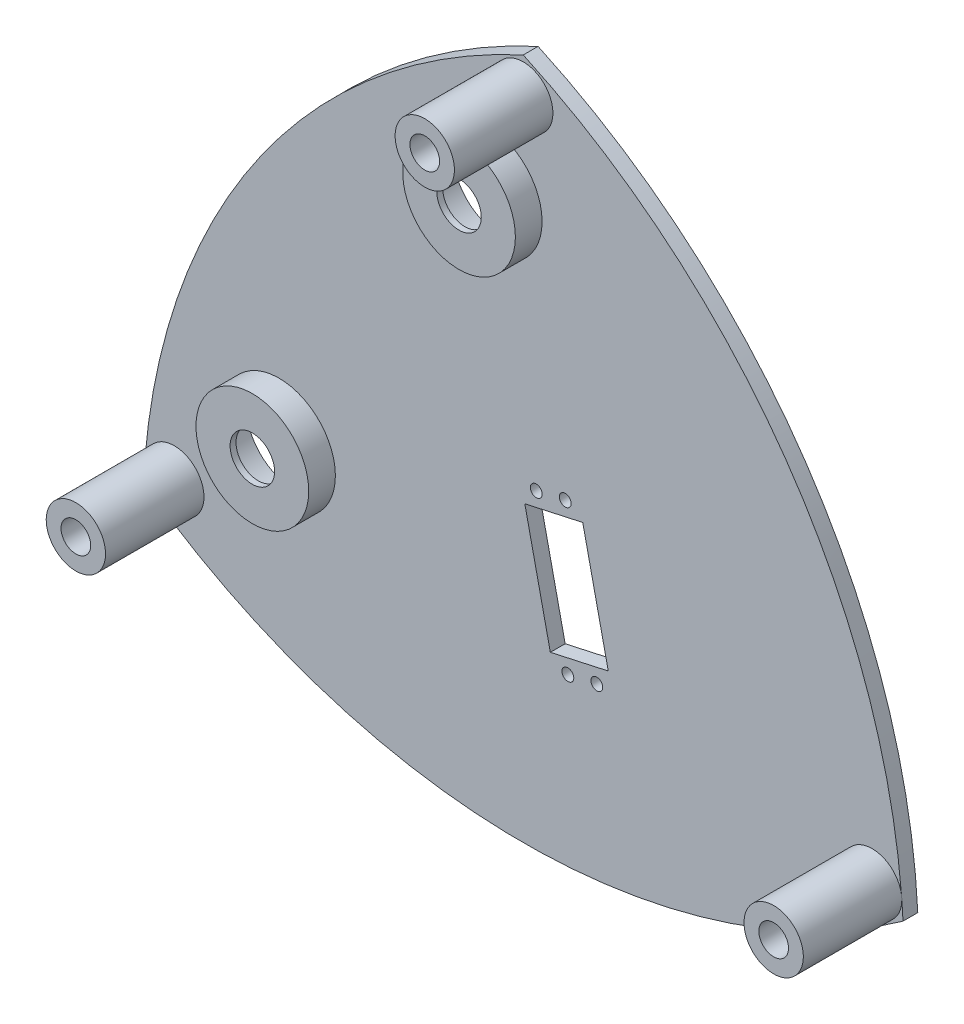
ISO-10303-21;
HEADER;
FILE_DESCRIPTION(('STEP AP214'),'2;1');
FILE_NAME('part.step','',(''),(''),'','','');
FILE_SCHEMA(('AUTOMOTIVE_DESIGN { 1 0 10303 214 1 1 1 1 }'));
ENDSEC;
DATA;
#1=APPLICATION_CONTEXT('core data for automotive mechanical design processes');
#2=APPLICATION_PROTOCOL_DEFINITION('international standard','automotive_design',2000,#1);
#3=PRODUCT_CONTEXT('',#1,'mechanical');
#4=PRODUCT('Part','Part','',(#3));
#5=PRODUCT_RELATED_PRODUCT_CATEGORY('part','',(#4));
#6=PRODUCT_DEFINITION_FORMATION('','',#4);
#7=PRODUCT_DEFINITION_CONTEXT('part definition',#1,'design');
#8=PRODUCT_DEFINITION('design','',#6,#7);
#9=PRODUCT_DEFINITION_SHAPE('','',#8);
#10=(LENGTH_UNIT() NAMED_UNIT(*) SI_UNIT(.MILLI.,.METRE.));
#11=(NAMED_UNIT(*) PLANE_ANGLE_UNIT() SI_UNIT($,.RADIAN.));
#12=(NAMED_UNIT(*) SI_UNIT($,.STERADIAN.) SOLID_ANGLE_UNIT());
#13=UNCERTAINTY_MEASURE_WITH_UNIT(LENGTH_MEASURE(1.E-05),#10,'distance_accuracy_value','');
#14=(GEOMETRIC_REPRESENTATION_CONTEXT(3) GLOBAL_UNCERTAINTY_ASSIGNED_CONTEXT((#13)) GLOBAL_UNIT_ASSIGNED_CONTEXT((#10,
#11,#12)) REPRESENTATION_CONTEXT('',''));
#15=CARTESIAN_POINT('',(0.,0.,0.));
#16=DIRECTION('',(0.,0.,1.));
#17=DIRECTION('',(1.,0.,0.));
#18=AXIS2_PLACEMENT_3D('',#15,#16,#17);
#19=CARTESIAN_POINT('',(-12.6509950664098,69.5155367413891,15.));
#20=DIRECTION('',(0.,0.,-1.));
#21=DIRECTION('',(-1.,0.,0.));
#22=AXIS2_PLACEMENT_3D('',#19,#20,#21);
#23=CYLINDRICAL_SURFACE('',#22,16.);
#24=CARTESIAN_POINT('',(-12.6509950664098,69.5155367413891,0.));
#25=DIRECTION('',(0.,0.,-1.));
#26=DIRECTION('',(-1.,0.,0.));
#27=AXIS2_PLACEMENT_3D('',#24,#25,#26);
#28=CIRCLE('',#27,16.);
#29=CARTESIAN_POINT('',(-28.6509950664098,69.5155367413891,0.));
#30=VERTEX_POINT('',#29);
#31=EDGE_CURVE('E168',#30,#30,#28,.T.);
#32=ORIENTED_EDGE('',*,*,#31,.T.);
#33=EDGE_LOOP('',(#32));
#34=FACE_BOUND('',#33,.T.);
#35=CARTESIAN_POINT('',(-12.6509950664098,69.5155367413891,12.));
#36=DIRECTION('',(0.,0.,1.));
#37=DIRECTION('',(1.,0.,0.));
#38=AXIS2_PLACEMENT_3D('',#35,#36,#37);
#39=CIRCLE('',#38,16.);
#40=CARTESIAN_POINT('',(3.34900493359024,69.5155367413891,12.));
#41=VERTEX_POINT('',#40);
#42=EDGE_CURVE('E11',#41,#41,#39,.F.);
#43=ORIENTED_EDGE('',*,*,#42,.F.);
#44=EDGE_LOOP('',(#43));
#45=FACE_BOUND('',#44,.T.);
#46=ADVANCED_FACE('F35',(#34,#45),#23,.F.);
#47=CARTESIAN_POINT('',(-82.3341256154467,-39.5307187827285,15.));
#48=DIRECTION('',(0.,0.,-1.));
#49=DIRECTION('',(-1.,0.,0.));
#50=AXIS2_PLACEMENT_3D('',#47,#48,#49);
#51=CYLINDRICAL_SURFACE('',#50,16.);
#52=CARTESIAN_POINT('',(-82.3341256154467,-39.5307187827285,0.));
#53=DIRECTION('',(0.,0.,-1.));
#54=DIRECTION('',(-1.,0.,0.));
#55=AXIS2_PLACEMENT_3D('',#52,#53,#54);
#56=CIRCLE('',#55,16.);
#57=CARTESIAN_POINT('',(-98.3341256154467,-39.5307187827285,0.));
#58=VERTEX_POINT('',#57);
#59=EDGE_CURVE('E171',#58,#58,#56,.T.);
#60=ORIENTED_EDGE('',*,*,#59,.T.);
#61=EDGE_LOOP('',(#60));
#62=FACE_BOUND('',#61,.T.);
#63=CARTESIAN_POINT('',(-82.3341256154467,-39.5307187827285,12.));
#64=DIRECTION('',(0.,0.,1.));
#65=DIRECTION('',(1.,0.,0.));
#66=AXIS2_PLACEMENT_3D('',#63,#64,#65);
#67=CIRCLE('',#66,16.);
#68=CARTESIAN_POINT('',(-66.3341256154467,-39.5307187827285,12.));
#69=VERTEX_POINT('',#68);
#70=EDGE_CURVE('E44',#69,#69,#67,.F.);
#71=ORIENTED_EDGE('',*,*,#70,.F.);
#72=EDGE_LOOP('',(#71));
#73=FACE_BOUND('',#72,.T.);
#74=ADVANCED_FACE('F278',(#62,#73),#51,.F.);
#75=CARTESIAN_POINT('',(-45.8494592180799,10.0108651432086,5.));
#76=DIRECTION('',(0.,0.,1.));
#77=DIRECTION('',(1.,0.,0.));
#78=AXIS2_PLACEMENT_3D('',#75,#76,#77);
#79=PLANE('',#78);
#80=CARTESIAN_POINT('',(24.8075352335168,-56.2577365393745,5.));
#81=DIRECTION('',(0.,0.,1.));
#82=DIRECTION('',(1.,0.,0.));
#83=AXIS2_PLACEMENT_3D('',#80,#81,#82);
#84=CIRCLE('',#83,2.);
#85=CARTESIAN_POINT('',(26.8075352335168,-56.2577365393745,5.));
#86=VERTEX_POINT('',#85);
#87=EDGE_CURVE('E262',#86,#86,#84,.T.);
#88=ORIENTED_EDGE('',*,*,#87,.F.);
#89=EDGE_LOOP('',(#88));
#90=FACE_BOUND('',#89,.T.);
#91=CARTESIAN_POINT('',(4.39491628208414,-10.067099094719,5.));
#92=DIRECTION('',(0.,0.,1.));
#93=DIRECTION('',(1.,0.,0.));
#94=AXIS2_PLACEMENT_3D('',#91,#92,#93);
#95=CIRCLE('',#94,2.);
#96=CARTESIAN_POINT('',(6.39491628208414,-10.067099094719,5.));
#97=VERTEX_POINT('',#96);
#98=EDGE_CURVE('E263',#97,#97,#95,.T.);
#99=ORIENTED_EDGE('',*,*,#98,.F.);
#100=EDGE_LOOP('',(#99));
#101=FACE_BOUND('',#100,.T.);
#102=CARTESIAN_POINT('',(14.1608715532331,-7.91625794718695,5.));
#103=DIRECTION('',(0.,0.,1.));
#104=DIRECTION('',(1.,0.,0.));
#105=AXIS2_PLACEMENT_3D('',#102,#103,#104);
#106=CIRCLE('',#105,2.);
#107=CARTESIAN_POINT('',(16.1608715532331,-7.91625794718695,5.));
#108=VERTEX_POINT('',#107);
#109=EDGE_CURVE('E266',#108,#108,#106,.T.);
#110=ORIENTED_EDGE('',*,*,#109,.F.);
#111=EDGE_LOOP('',(#110));
#112=FACE_BOUND('',#111,.T.);
#113=CARTESIAN_POINT('',(15.0415799623678,-58.4085776869066,5.));
#114=DIRECTION('',(0.,0.,1.));
#115=DIRECTION('',(1.,0.,0.));
#116=AXIS2_PLACEMENT_3D('',#113,#114,#115);
#117=CIRCLE('',#116,2.00000000000001);
#118=CARTESIAN_POINT('',(17.0415799623678,-58.4085776869066,5.));
#119=VERTEX_POINT('',#118);
#120=EDGE_CURVE('E250',#119,#119,#117,.T.);
#121=ORIENTED_EDGE('',*,*,#120,.F.);
#122=EDGE_LOOP('',(#121));
#123=FACE_BOUND('',#122,.T.);
#124=DIRECTION('',(0.215084114753205,-0.976595527114901,0.));
#125=VECTOR('',#124,1.);
#126=CARTESIAN_POINT('',(-7.02980536355838,18.5604546636439,5.));
#127=LINE('',#126,#125);
#128=CARTESIAN_POINT('',(0.53358819158736,-15.7813484222808,5.));
#129=VERTEX_POINT('',#128);
#130=CARTESIAN_POINT('',(9.13695278171554,-54.8451695068768,5.));
#131=VERTEX_POINT('',#130);
#132=EDGE_CURVE('E141',#129,#131,#127,.T.);
#133=ORIENTED_EDGE('',*,*,#132,.F.);
#134=DIRECTION('',(-0.976595527114901,-0.215084114753205,0.));
#135=VECTOR('',#134,1.);
#136=CARTESIAN_POINT('',(-38.2860656629342,-24.3309379427162,5.));
#137=LINE('',#136,#135);
#138=CARTESIAN_POINT('',(20.0654987338854,-11.4796661272167,5.));
#139=VERTEX_POINT('',#138);
#140=EDGE_CURVE('E134',#139,#129,#137,.T.);
#141=ORIENTED_EDGE('',*,*,#140,.F.);
#142=DIRECTION('',(-0.215084114753205,0.976595527114901,0.));
#143=VECTOR('',#142,1.);
#144=CARTESIAN_POINT('',(12.5021051787396,22.862136958708,5.));
#145=LINE('',#144,#143);
#146=CARTESIAN_POINT('',(28.6688633240136,-50.5434872118127,5.));
#147=VERTEX_POINT('',#146);
#148=EDGE_CURVE('E114',#147,#139,#145,.T.);
#149=ORIENTED_EDGE('',*,*,#148,.F.);
#150=DIRECTION('',(0.976595527114901,0.215084114753205,0.));
#151=VECTOR('',#150,1.);
#152=CARTESIAN_POINT('',(-29.682701072806,-63.3947590273122,5.));
#153=LINE('',#152,#151);
#154=EDGE_CURVE('E139',#131,#147,#153,.T.);
#155=ORIENTED_EDGE('',*,*,#154,.F.);
#156=EDGE_LOOP('',(#133,#141,#149,#155));
#157=FACE_BOUND('',#156,.T.);
#158=CARTESIAN_POINT('',(-82.3341256154467,-39.5307187827285,5.));
#159=DIRECTION('',(0.,0.,1.));
#160=DIRECTION('',(1.,0.,0.));
#161=AXIS2_PLACEMENT_3D('',#158,#159,#160);
#162=CIRCLE('',#161,19.);
#163=CARTESIAN_POINT('',(-63.3341256154467,-39.5307187827285,5.));
#164=VERTEX_POINT('',#163);
#165=EDGE_CURVE('E162',#164,#164,#162,.T.);
#166=ORIENTED_EDGE('',*,*,#165,.F.);
#167=EDGE_LOOP('',(#166));
#168=FACE_BOUND('',#167,.T.);
#169=CARTESIAN_POINT('',(0.,103.,5.));
#170=DIRECTION('',(0.,0.,1.));
#171=DIRECTION('',(1.,0.,0.));
#172=AXIS2_PLACEMENT_3D('',#169,#170,#171);
#173=CIRCLE('',#172,10.);
#174=CARTESIAN_POINT('',(-10.,103.,5.));
#175=VERTEX_POINT('',#174);
#176=EDGE_CURVE('E205',#175,#175,#173,.T.);
#177=ORIENTED_EDGE('',*,*,#176,.F.);
#178=EDGE_LOOP('',(#177));
#179=FACE_BOUND('',#178,.T.);
#180=CARTESIAN_POINT('',(-91.6989184361599,-84.9782697135829,5.));
#181=DIRECTION('',(0.,0.,1.));
#182=DIRECTION('',(1.,0.,0.));
#183=AXIS2_PLACEMENT_3D('',#180,#181,#182);
#184=CIRCLE('',#183,220.);
#185=CARTESIAN_POINT('',(128.022678921713,-73.9139281378286,5.));
#186=VERTEX_POINT('',#185);
#187=CARTESIAN_POINT('',(127.62978060665,-67.804983010433,5.));
#188=VERTEX_POINT('',#187);
#189=EDGE_CURVE('E226',#186,#188,#184,.T.);
#190=ORIENTED_EDGE('',*,*,#189,.T.);
#191=CARTESIAN_POINT('',(117.630374076299,-67.9139281378286,5.));
#192=DIRECTION('',(0.,0.,1.));
#193=DIRECTION('',(1.,0.,0.));
#194=AXIS2_PLACEMENT_3D('',#191,#192,#193);
#195=CIRCLE('',#194,9.99999999999999);
#196=CARTESIAN_POINT('',(127.515403429057,-66.4019113736612,5.));
#197=VERTEX_POINT('',#196);
#198=EDGE_CURVE('E179',#197,#188,#195,.T.);
#199=ORIENTED_EDGE('',*,*,#198,.F.);
#200=CARTESIAN_POINT('',(0.,115.,5.));
#201=VERTEX_POINT('',#200);
#202=EDGE_CURVE('E224',#197,#201,#184,.T.);
#203=ORIENTED_EDGE('',*,*,#202,.T.);
#204=CARTESIAN_POINT('',(91.6989184361599,-84.9782697135829,5.));
#205=DIRECTION('',(0.,0.,1.));
#206=DIRECTION('',(-1.,0.,0.));
#207=AXIS2_PLACEMENT_3D('',#204,#205,#206);
#208=CIRCLE('',#207,220.);
#209=CARTESIAN_POINT('',(-127.515403429057,-66.4019113736612,5.));
#210=VERTEX_POINT('',#209);
#211=EDGE_CURVE('E230',#201,#210,#208,.T.);
#212=ORIENTED_EDGE('',*,*,#211,.T.);
#213=CARTESIAN_POINT('',(-117.630374076299,-67.9139281378286,5.));
#214=DIRECTION('',(0.,0.,1.));
#215=DIRECTION('',(1.,0.,0.));
#216=AXIS2_PLACEMENT_3D('',#213,#214,#215);
#217=CIRCLE('',#216,9.99999999999999);
#218=CARTESIAN_POINT('',(-127.62978060665,-67.804983010433,5.));
#219=VERTEX_POINT('',#218);
#220=EDGE_CURVE('E192',#219,#210,#217,.T.);
#221=ORIENTED_EDGE('',*,*,#220,.F.);
#222=CARTESIAN_POINT('',(-128.022678921713,-73.9139281378286,5.));
#223=VERTEX_POINT('',#222);
#224=EDGE_CURVE('E229',#219,#223,#208,.T.);
#225=ORIENTED_EDGE('',*,*,#224,.T.);
#226=CARTESIAN_POINT('',(0.,105.,5.));
#227=DIRECTION('',(0.,0.,1.));
#228=DIRECTION('',(1.,0.,0.));
#229=AXIS2_PLACEMENT_3D('',#226,#227,#228);
#230=CIRCLE('',#229,220.);
#231=EDGE_CURVE('E221',#223,#186,#230,.T.);
#232=ORIENTED_EDGE('',*,*,#231,.T.);
#233=EDGE_LOOP('',(#190,#199,#203,#212,#221,#225,#232));
#234=FACE_BOUND('',#233,.T.);
#235=CARTESIAN_POINT('',(-12.6509950664098,69.5155367413891,5.));
#236=DIRECTION('',(0.,0.,1.));
#237=DIRECTION('',(1.,0.,0.));
#238=AXIS2_PLACEMENT_3D('',#235,#236,#237);
#239=CIRCLE('',#238,19.);
#240=CARTESIAN_POINT('',(6.34900493359023,69.5155367413891,5.));
#241=VERTEX_POINT('',#240);
#242=EDGE_CURVE('E153',#241,#241,#239,.T.);
#243=ORIENTED_EDGE('',*,*,#242,.F.);
#244=EDGE_LOOP('',(#243));
#245=FACE_BOUND('',#244,.T.);
#246=ADVANCED_FACE('F275',(#90,#101,#112,#123,#157,#168,#179,#234,#245),#79,.T.);
#247=CARTESIAN_POINT('',(-45.8494592180799,10.0108651432086,0.));
#248=DIRECTION('',(0.,0.,1.));
#249=DIRECTION('',(1.,0.,0.));
#250=AXIS2_PLACEMENT_3D('',#247,#248,#249);
#251=PLANE('',#250);
#252=CARTESIAN_POINT('',(24.8075352335168,-56.2577365393745,0.));
#253=DIRECTION('',(0.,0.,1.));
#254=DIRECTION('',(1.,0.,0.));
#255=AXIS2_PLACEMENT_3D('',#252,#253,#254);
#256=CIRCLE('',#255,2.);
#257=CARTESIAN_POINT('',(26.8075352335168,-56.2577365393745,0.));
#258=VERTEX_POINT('',#257);
#259=EDGE_CURVE('E39',#258,#258,#256,.T.);
#260=ORIENTED_EDGE('',*,*,#259,.T.);
#261=EDGE_LOOP('',(#260));
#262=FACE_BOUND('',#261,.T.);
#263=CARTESIAN_POINT('',(4.39491628208414,-10.067099094719,0.));
#264=DIRECTION('',(0.,0.,1.));
#265=DIRECTION('',(1.,0.,0.));
#266=AXIS2_PLACEMENT_3D('',#263,#264,#265);
#267=CIRCLE('',#266,2.);
#268=CARTESIAN_POINT('',(6.39491628208414,-10.067099094719,0.));
#269=VERTEX_POINT('',#268);
#270=EDGE_CURVE('E252',#269,#269,#267,.T.);
#271=ORIENTED_EDGE('',*,*,#270,.T.);
#272=EDGE_LOOP('',(#271));
#273=FACE_BOUND('',#272,.T.);
#274=CARTESIAN_POINT('',(14.1608715532331,-7.91625794718695,0.));
#275=DIRECTION('',(0.,0.,1.));
#276=DIRECTION('',(1.,0.,0.));
#277=AXIS2_PLACEMENT_3D('',#274,#275,#276);
#278=CIRCLE('',#277,2.);
#279=CARTESIAN_POINT('',(16.1608715532331,-7.91625794718695,0.));
#280=VERTEX_POINT('',#279);
#281=EDGE_CURVE('E249',#280,#280,#278,.T.);
#282=ORIENTED_EDGE('',*,*,#281,.T.);
#283=EDGE_LOOP('',(#282));
#284=FACE_BOUND('',#283,.T.);
#285=CARTESIAN_POINT('',(15.0415799623678,-58.4085776869066,0.));
#286=DIRECTION('',(0.,0.,1.));
#287=DIRECTION('',(1.,0.,0.));
#288=AXIS2_PLACEMENT_3D('',#285,#286,#287);
#289=CIRCLE('',#288,2.00000000000001);
#290=CARTESIAN_POINT('',(17.0415799623678,-58.4085776869066,0.));
#291=VERTEX_POINT('',#290);
#292=EDGE_CURVE('E246',#291,#291,#289,.T.);
#293=ORIENTED_EDGE('',*,*,#292,.T.);
#294=EDGE_LOOP('',(#293));
#295=FACE_BOUND('',#294,.T.);
#296=DIRECTION('',(0.976595527114901,0.215084114753205,0.));
#297=VECTOR('',#296,1.);
#298=CARTESIAN_POINT('',(20.0654987338854,-11.4796661272167,0.));
#299=LINE('',#298,#297);
#300=CARTESIAN_POINT('',(0.533588191587359,-15.7813484222808,0.));
#301=VERTEX_POINT('',#300);
#302=CARTESIAN_POINT('',(20.0654987338854,-11.4796661272167,0.));
#303=VERTEX_POINT('',#302);
#304=EDGE_CURVE('E120',#301,#303,#299,.T.);
#305=ORIENTED_EDGE('',*,*,#304,.F.);
#306=DIRECTION('',(-0.215084114753205,0.9765955271149,0.));
#307=VECTOR('',#306,1.);
#308=CARTESIAN_POINT('',(0.53358819158736,-15.7813484222808,0.));
#309=LINE('',#308,#307);
#310=CARTESIAN_POINT('',(9.13695278171554,-54.8451695068768,0.));
#311=VERTEX_POINT('',#310);
#312=EDGE_CURVE('E60',#311,#301,#309,.T.);
#313=ORIENTED_EDGE('',*,*,#312,.F.);
#314=DIRECTION('',(-0.976595527114901,-0.215084114753205,0.));
#315=VECTOR('',#314,1.);
#316=CARTESIAN_POINT('',(9.13695278171554,-54.8451695068768,0.));
#317=LINE('',#316,#315);
#318=CARTESIAN_POINT('',(28.6688633240136,-50.5434872118127,0.));
#319=VERTEX_POINT('',#318);
#320=EDGE_CURVE('E127',#319,#311,#317,.T.);
#321=ORIENTED_EDGE('',*,*,#320,.F.);
#322=DIRECTION('',(0.215084114753205,-0.9765955271149,0.));
#323=VECTOR('',#322,1.);
#324=CARTESIAN_POINT('',(28.6688633240136,-50.5434872118127,0.));
#325=LINE('',#324,#323);
#326=EDGE_CURVE('E111',#303,#319,#325,.T.);
#327=ORIENTED_EDGE('',*,*,#326,.F.);
#328=EDGE_LOOP('',(#305,#313,#321,#327));
#329=FACE_BOUND('',#328,.T.);
#330=ORIENTED_EDGE('',*,*,#59,.F.);
#331=EDGE_LOOP('',(#330));
#332=FACE_BOUND('',#331,.T.);
#333=ORIENTED_EDGE('',*,*,#31,.F.);
#334=EDGE_LOOP('',(#333));
#335=FACE_BOUND('',#334,.T.);
#336=CARTESIAN_POINT('',(0.,105.,0.));
#337=DIRECTION('',(0.,0.,1.));
#338=DIRECTION('',(1.,0.,0.));
#339=AXIS2_PLACEMENT_3D('',#336,#337,#338);
#340=CIRCLE('',#339,220.);
#341=CARTESIAN_POINT('',(-128.022678921713,-73.9139281378286,0.));
#342=VERTEX_POINT('',#341);
#343=CARTESIAN_POINT('',(128.022678921713,-73.9139281378286,0.));
#344=VERTEX_POINT('',#343);
#345=EDGE_CURVE('E220',#342,#344,#340,.T.);
#346=ORIENTED_EDGE('',*,*,#345,.F.);
#347=CARTESIAN_POINT('',(91.6989184361599,-84.9782697135829,0.));
#348=DIRECTION('',(0.,0.,1.));
#349=DIRECTION('',(-1.,0.,0.));
#350=AXIS2_PLACEMENT_3D('',#347,#348,#349);
#351=CIRCLE('',#350,220.);
#352=CARTESIAN_POINT('',(0.,115.,0.));
#353=VERTEX_POINT('',#352);
#354=EDGE_CURVE('E225',#353,#342,#351,.T.);
#355=ORIENTED_EDGE('',*,*,#354,.F.);
#356=CARTESIAN_POINT('',(-91.6989184361599,-84.9782697135829,0.));
#357=DIRECTION('',(0.,0.,1.));
#358=DIRECTION('',(1.,0.,0.));
#359=AXIS2_PLACEMENT_3D('',#356,#357,#358);
#360=CIRCLE('',#359,220.);
#361=EDGE_CURVE('E236',#344,#353,#360,.T.);
#362=ORIENTED_EDGE('',*,*,#361,.F.);
#363=EDGE_LOOP('',(#346,#355,#362));
#364=FACE_BOUND('',#363,.T.);
#365=CARTESIAN_POINT('',(-117.630374076299,-67.9139281378286,0.));
#366=DIRECTION('',(0.,0.,1.));
#367=DIRECTION('',(1.,0.,0.));
#368=AXIS2_PLACEMENT_3D('',#365,#366,#367);
#369=CIRCLE('',#368,5.00000000000001);
#370=CARTESIAN_POINT('',(-112.630374076299,-67.9139281378286,0.));
#371=VERTEX_POINT('',#370);
#372=EDGE_CURVE('E217',#371,#371,#369,.T.);
#373=ORIENTED_EDGE('',*,*,#372,.T.);
#374=EDGE_LOOP('',(#373));
#375=FACE_BOUND('',#374,.T.);
#376=CARTESIAN_POINT('',(117.630374076299,-67.9139281378286,0.));
#377=DIRECTION('',(0.,0.,1.));
#378=DIRECTION('',(1.,0.,0.));
#379=AXIS2_PLACEMENT_3D('',#376,#377,#378);
#380=CIRCLE('',#379,5.00000000000001);
#381=CARTESIAN_POINT('',(122.630374076299,-67.9139281378286,0.));
#382=VERTEX_POINT('',#381);
#383=EDGE_CURVE('E214',#382,#382,#380,.T.);
#384=ORIENTED_EDGE('',*,*,#383,.T.);
#385=EDGE_LOOP('',(#384));
#386=FACE_BOUND('',#385,.T.);
#387=CARTESIAN_POINT('',(0.,103.,0.));
#388=DIRECTION('',(0.,0.,1.));
#389=DIRECTION('',(1.,0.,0.));
#390=AXIS2_PLACEMENT_3D('',#387,#388,#389);
#391=CIRCLE('',#390,5.);
#392=CARTESIAN_POINT('',(5.,103.,0.));
#393=VERTEX_POINT('',#392);
#394=EDGE_CURVE('E209',#393,#393,#391,.T.);
#395=ORIENTED_EDGE('',*,*,#394,.T.);
#396=EDGE_LOOP('',(#395));
#397=FACE_BOUND('',#396,.T.);
#398=ADVANCED_FACE('F124',(#262,#273,#284,#295,#329,#332,#335,#364,#375,#386,#397),#251,.F.);
#399=CARTESIAN_POINT('',(0.,105.,5.));
#400=DIRECTION('',(0.,0.,-1.));
#401=DIRECTION('',(-1.,0.,0.));
#402=AXIS2_PLACEMENT_3D('',#399,#400,#401);
#403=CYLINDRICAL_SURFACE('',#402,220.);
#404=ORIENTED_EDGE('',*,*,#345,.T.);
#405=DIRECTION('',(0.,0.,-1.));
#406=VECTOR('',#405,1.);
#407=CARTESIAN_POINT('',(128.022678921713,-73.9139281378286,5.));
#408=LINE('',#407,#406);
#409=EDGE_CURVE('E158',#186,#344,#408,.T.);
#410=ORIENTED_EDGE('',*,*,#409,.F.);
#411=ORIENTED_EDGE('',*,*,#231,.F.);
#412=DIRECTION('',(0.,0.,-1.));
#413=VECTOR('',#412,1.);
#414=CARTESIAN_POINT('',(-128.022678921713,-73.9139281378286,5.));
#415=LINE('',#414,#413);
#416=EDGE_CURVE('E233',#223,#342,#415,.T.);
#417=ORIENTED_EDGE('',*,*,#416,.T.);
#418=EDGE_LOOP('',(#404,#410,#411,#417));
#419=FACE_BOUND('',#418,.T.);
#420=ADVANCED_FACE('F37',(#419),#403,.T.);
#421=CARTESIAN_POINT('',(-91.6989184361599,-84.9782697135829,5.));
#422=DIRECTION('',(0.,0.,-1.));
#423=DIRECTION('',(-1.,0.,0.));
#424=AXIS2_PLACEMENT_3D('',#421,#422,#423);
#425=CYLINDRICAL_SURFACE('',#424,220.);
#426=ORIENTED_EDGE('',*,*,#361,.T.);
#427=DIRECTION('',(0.,0.,-1.));
#428=VECTOR('',#427,1.);
#429=CARTESIAN_POINT('',(0.,115.,5.));
#430=LINE('',#429,#428);
#431=EDGE_CURVE('E241',#201,#353,#430,.T.);
#432=ORIENTED_EDGE('',*,*,#431,.F.);
#433=ORIENTED_EDGE('',*,*,#202,.F.);
#434=CARTESIAN_POINT('',(-91.6989184361599,-84.9782697135829,5.));
#435=DIRECTION('',(0.,0.,1.));
#436=DIRECTION('',(1.,0.,0.));
#437=AXIS2_PLACEMENT_3D('',#434,#435,#436);
#438=CIRCLE('',#437,220.);
#439=EDGE_CURVE('E183',#188,#197,#438,.T.);
#440=ORIENTED_EDGE('',*,*,#439,.F.);
#441=ORIENTED_EDGE('',*,*,#189,.F.);
#442=ORIENTED_EDGE('',*,*,#409,.T.);
#443=EDGE_LOOP('',(#426,#432,#433,#440,#441,#442));
#444=FACE_BOUND('',#443,.T.);
#445=ADVANCED_FACE('F373',(#444),#425,.T.);
#446=CARTESIAN_POINT('',(91.6989184361599,-84.9782697135829,5.));
#447=DIRECTION('',(0.,0.,-1.));
#448=DIRECTION('',(-1.,0.,0.));
#449=AXIS2_PLACEMENT_3D('',#446,#447,#448);
#450=CYLINDRICAL_SURFACE('',#449,220.);
#451=ORIENTED_EDGE('',*,*,#354,.T.);
#452=ORIENTED_EDGE('',*,*,#416,.F.);
#453=ORIENTED_EDGE('',*,*,#224,.F.);
#454=CARTESIAN_POINT('',(91.6989184361599,-84.9782697135829,5.));
#455=DIRECTION('',(0.,0.,1.));
#456=DIRECTION('',(1.,0.,0.));
#457=AXIS2_PLACEMENT_3D('',#454,#455,#456);
#458=CIRCLE('',#457,220.);
#459=EDGE_CURVE('E196',#210,#219,#458,.T.);
#460=ORIENTED_EDGE('',*,*,#459,.F.);
#461=ORIENTED_EDGE('',*,*,#211,.F.);
#462=ORIENTED_EDGE('',*,*,#431,.T.);
#463=EDGE_LOOP('',(#451,#452,#453,#460,#461,#462));
#464=FACE_BOUND('',#463,.T.);
#465=ADVANCED_FACE('F367',(#464),#450,.T.);
#466=CARTESIAN_POINT('',(-117.630374076299,-67.9139281378286,5.));
#467=DIRECTION('',(0.,0.,-1.));
#468=DIRECTION('',(-1.,0.,0.));
#469=AXIS2_PLACEMENT_3D('',#466,#467,#468);
#470=CYLINDRICAL_SURFACE('',#469,5.00000000000001);
#471=ORIENTED_EDGE('',*,*,#372,.F.);
#472=EDGE_LOOP('',(#471));
#473=FACE_BOUND('',#472,.T.);
#474=CARTESIAN_POINT('',(-117.630374076299,-67.9139281378286,38.2));
#475=DIRECTION('',(0.,0.,1.));
#476=DIRECTION('',(1.,0.,0.));
#477=AXIS2_PLACEMENT_3D('',#474,#475,#476);
#478=CIRCLE('',#477,5.00000000000001);
#479=CARTESIAN_POINT('',(-112.630374076299,-67.9139281378286,38.2));
#480=VERTEX_POINT('',#479);
#481=EDGE_CURVE('E189',#480,#480,#478,.T.);
#482=ORIENTED_EDGE('',*,*,#481,.T.);
#483=EDGE_LOOP('',(#482));
#484=FACE_BOUND('',#483,.T.);
#485=ADVANCED_FACE('F364',(#473,#484),#470,.F.);
#486=CARTESIAN_POINT('',(117.630374076299,-67.9139281378286,5.));
#487=DIRECTION('',(0.,0.,-1.));
#488=DIRECTION('',(-1.,0.,0.));
#489=AXIS2_PLACEMENT_3D('',#486,#487,#488);
#490=CYLINDRICAL_SURFACE('',#489,5.00000000000001);
#491=ORIENTED_EDGE('',*,*,#383,.F.);
#492=EDGE_LOOP('',(#491));
#493=FACE_BOUND('',#492,.T.);
#494=CARTESIAN_POINT('',(117.630374076299,-67.9139281378286,38.2));
#495=DIRECTION('',(0.,0.,1.));
#496=DIRECTION('',(1.,0.,0.));
#497=AXIS2_PLACEMENT_3D('',#494,#495,#496);
#498=CIRCLE('',#497,5.00000000000001);
#499=CARTESIAN_POINT('',(122.630374076299,-67.9139281378286,38.2));
#500=VERTEX_POINT('',#499);
#501=EDGE_CURVE('E174',#500,#500,#498,.T.);
#502=ORIENTED_EDGE('',*,*,#501,.T.);
#503=EDGE_LOOP('',(#502));
#504=FACE_BOUND('',#503,.T.);
#505=ADVANCED_FACE('F360',(#493,#504),#490,.F.);
#506=CARTESIAN_POINT('',(0.,103.,5.));
#507=DIRECTION('',(0.,0.,-1.));
#508=DIRECTION('',(-1.,0.,0.));
#509=AXIS2_PLACEMENT_3D('',#506,#507,#508);
#510=CYLINDRICAL_SURFACE('',#509,5.);
#511=ORIENTED_EDGE('',*,*,#394,.F.);
#512=EDGE_LOOP('',(#511));
#513=FACE_BOUND('',#512,.T.);
#514=CARTESIAN_POINT('',(0.,103.,38.2));
#515=DIRECTION('',(0.,0.,1.));
#516=DIRECTION('',(1.,0.,0.));
#517=AXIS2_PLACEMENT_3D('',#514,#515,#516);
#518=CIRCLE('',#517,5.);
#519=CARTESIAN_POINT('',(5.,103.,38.2));
#520=VERTEX_POINT('',#519);
#521=EDGE_CURVE('E202',#520,#520,#518,.T.);
#522=ORIENTED_EDGE('',*,*,#521,.T.);
#523=EDGE_LOOP('',(#522));
#524=FACE_BOUND('',#523,.T.);
#525=ADVANCED_FACE('F353',(#513,#524),#510,.F.);
#526=CARTESIAN_POINT('',(0.,103.,38.2));
#527=DIRECTION('',(0.,0.,1.));
#528=DIRECTION('',(1.,0.,0.));
#529=AXIS2_PLACEMENT_3D('',#526,#527,#528);
#530=PLANE('',#529);
#531=CARTESIAN_POINT('',(0.,103.,38.2));
#532=DIRECTION('',(0.,0.,1.));
#533=DIRECTION('',(1.,0.,0.));
#534=AXIS2_PLACEMENT_3D('',#531,#532,#533);
#535=CIRCLE('',#534,10.);
#536=CARTESIAN_POINT('',(-10.,103.,38.2));
#537=VERTEX_POINT('',#536);
#538=EDGE_CURVE('E206',#537,#537,#535,.T.);
#539=ORIENTED_EDGE('',*,*,#538,.T.);
#540=EDGE_LOOP('',(#539));
#541=FACE_BOUND('',#540,.T.);
#542=ORIENTED_EDGE('',*,*,#521,.F.);
#543=EDGE_LOOP('',(#542));
#544=FACE_BOUND('',#543,.T.);
#545=ADVANCED_FACE('F350',(#541,#544),#530,.T.);
#546=CARTESIAN_POINT('',(0.,103.,38.2));
#547=DIRECTION('',(0.,0.,-1.));
#548=DIRECTION('',(-1.,0.,0.));
#549=AXIS2_PLACEMENT_3D('',#546,#547,#548);
#550=CYLINDRICAL_SURFACE('',#549,10.);
#551=CARTESIAN_POINT('',(-10.,103.,38.2));
#552=CARTESIAN_POINT('',(-10.,103.,37.8541666666667));
#553=CARTESIAN_POINT('',(-10.,103.,37.5083333333333));
#554=CARTESIAN_POINT('',(-10.,103.,36.8166666666667));
#555=CARTESIAN_POINT('',(-10.,103.,36.4708333333333));
#556=CARTESIAN_POINT('',(-10.,103.,35.7791666666667));
#557=CARTESIAN_POINT('',(-10.,103.,35.4333333333333));
#558=CARTESIAN_POINT('',(-10.,103.,34.7416666666667));
#559=CARTESIAN_POINT('',(-10.,103.,34.3958333333333));
#560=CARTESIAN_POINT('',(-10.,103.,33.7041666666667));
#561=CARTESIAN_POINT('',(-10.,103.,33.3583333333333));
#562=CARTESIAN_POINT('',(-10.,103.,32.6666666666667));
#563=CARTESIAN_POINT('',(-10.,103.,32.3208333333333));
#564=CARTESIAN_POINT('',(-10.,103.,31.6291666666667));
#565=CARTESIAN_POINT('',(-10.,103.,31.2833333333333));
#566=CARTESIAN_POINT('',(-10.,103.,30.5916666666667));
#567=CARTESIAN_POINT('',(-10.,103.,30.2458333333333));
#568=CARTESIAN_POINT('',(-10.,103.,29.5541666666667));
#569=CARTESIAN_POINT('',(-10.,103.,29.2083333333333));
#570=CARTESIAN_POINT('',(-10.,103.,28.5166666666667));
#571=CARTESIAN_POINT('',(-10.,103.,28.1708333333333));
#572=CARTESIAN_POINT('',(-10.,103.,27.4791666666667));
#573=CARTESIAN_POINT('',(-10.,103.,27.1333333333333));
#574=CARTESIAN_POINT('',(-10.,103.,26.4416666666667));
#575=CARTESIAN_POINT('',(-10.,103.,26.0958333333333));
#576=CARTESIAN_POINT('',(-10.,103.,25.4041666666667));
#577=CARTESIAN_POINT('',(-10.,103.,25.0583333333333));
#578=CARTESIAN_POINT('',(-10.,103.,24.3666666666667));
#579=CARTESIAN_POINT('',(-10.,103.,24.0208333333333));
#580=CARTESIAN_POINT('',(-10.,103.,23.3291666666667));
#581=CARTESIAN_POINT('',(-10.,103.,22.9833333333333));
#582=CARTESIAN_POINT('',(-10.,103.,22.2916666666667));
#583=CARTESIAN_POINT('',(-10.,103.,21.9458333333333));
#584=CARTESIAN_POINT('',(-10.,103.,21.2541666666667));
#585=CARTESIAN_POINT('',(-10.,103.,20.9083333333333));
#586=CARTESIAN_POINT('',(-10.,103.,20.2166666666667));
#587=CARTESIAN_POINT('',(-10.,103.,19.8708333333333));
#588=CARTESIAN_POINT('',(-10.,103.,19.1791666666667));
#589=CARTESIAN_POINT('',(-10.,103.,18.8333333333333));
#590=CARTESIAN_POINT('',(-10.,103.,18.1416666666667));
#591=CARTESIAN_POINT('',(-10.,103.,17.7958333333333));
#592=CARTESIAN_POINT('',(-10.,103.,17.1041666666667));
#593=CARTESIAN_POINT('',(-10.,103.,16.7583333333333));
#594=CARTESIAN_POINT('',(-10.,103.,16.0666666666667));
#595=CARTESIAN_POINT('',(-10.,103.,15.7208333333333));
#596=CARTESIAN_POINT('',(-10.,103.,15.0291666666667));
#597=CARTESIAN_POINT('',(-10.,103.,14.6833333333333));
#598=CARTESIAN_POINT('',(-10.,103.,13.9916666666667));
#599=CARTESIAN_POINT('',(-10.,103.,13.6458333333333));
#600=CARTESIAN_POINT('',(-10.,103.,12.9541666666667));
#601=CARTESIAN_POINT('',(-10.,103.,12.6083333333333));
#602=CARTESIAN_POINT('',(-10.,103.,11.9166666666667));
#603=CARTESIAN_POINT('',(-10.,103.,11.5708333333333));
#604=CARTESIAN_POINT('',(-10.,103.,10.8791666666667));
#605=CARTESIAN_POINT('',(-10.,103.,10.5333333333333));
#606=CARTESIAN_POINT('',(-10.,103.,9.84166666666667));
#607=CARTESIAN_POINT('',(-10.,103.,9.49583333333333));
#608=CARTESIAN_POINT('',(-10.,103.,8.80416666666667));
#609=CARTESIAN_POINT('',(-10.,103.,8.45833333333333));
#610=CARTESIAN_POINT('',(-10.,103.,7.76666666666666));
#611=CARTESIAN_POINT('',(-10.,103.,7.42083333333333));
#612=CARTESIAN_POINT('',(-10.,103.,6.72916666666666));
#613=CARTESIAN_POINT('',(-10.,103.,6.38333333333333));
#614=CARTESIAN_POINT('',(-10.,103.,5.69166666666666));
#615=CARTESIAN_POINT('',(-10.,103.,5.34583333333333));
#616=CARTESIAN_POINT('',(-10.,103.,5.));
#617=B_SPLINE_CURVE_WITH_KNOTS('',3,(#551,#552,#553,#554,#555,#556,#557,#558,#559,#560,#561,
#562,#563,#564,#565,#566,#567,#568,#569,#570,#571,#572,#573,#574,#575,#576,#577,#578,#579,#580,
#581,#582,#583,#584,#585,#586,#587,#588,#589,#590,#591,#592,#593,#594,#595,#596,#597,#598,#599,
#600,#601,#602,#603,#604,#605,#606,#607,#608,#609,#610,#611,#612,#613,#614,#615,#616),
.UNSPECIFIED.,.F.,.F.,(4,2,2,2,2,2,2,2,2,2,2,2,2,2,2,2,2,2,2,2,2,2,2,2,2,2,2,2,2,2,2,2,4),(0.,
1.0375,2.07499999999999,3.1125,4.14999999999999,5.1875,6.22499999999999,7.26249999999999,8.3,
9.3375,10.375,11.4125,12.45,13.4875,14.525,15.5625,16.6,17.6375,18.675,19.7125,20.75,21.7875,
22.825,23.8625,24.9,25.9375,26.975,28.0125,29.05,30.0875,31.125,32.1625,33.2),.UNSPECIFIED.);
#618=EDGE_CURVE('BSEAM345',#537,#175,#617,.T.);
#619=ORIENTED_EDGE('',*,*,#538,.F.);
#620=ORIENTED_EDGE('',*,*,#176,.T.);
#621=ORIENTED_EDGE('',*,*,#618,.T.);
#622=ORIENTED_EDGE('',*,*,#618,.F.);
#623=EDGE_LOOP('',(#619,#621,#620,#622));
#624=FACE_BOUND('',#623,.T.);
#625=ADVANCED_FACE('F345',(#624),#550,.T.);
#626=CARTESIAN_POINT('',(-117.630374076299,-67.9139281378286,5.));
#627=DIRECTION('',(0.,0.,1.));
#628=DIRECTION('',(1.,0.,0.));
#629=AXIS2_PLACEMENT_3D('',#626,#627,#628);
#630=PLANE('',#629);
#631=EDGE_CURVE('E197',#210,#219,#217,.T.);
#632=ORIENTED_EDGE('',*,*,#631,.F.);
#633=ORIENTED_EDGE('',*,*,#459,.T.);
#634=EDGE_LOOP('',(#632,#633));
#635=FACE_BOUND('',#634,.T.);
#636=ADVANCED_FACE('F341',(#635),#630,.F.);
#637=CARTESIAN_POINT('',(-117.630374076299,-67.9139281378286,38.2));
#638=DIRECTION('',(0.,0.,1.));
#639=DIRECTION('',(1.,0.,0.));
#640=AXIS2_PLACEMENT_3D('',#637,#638,#639);
#641=PLANE('',#640);
#642=CARTESIAN_POINT('',(-117.630374076299,-67.9139281378286,38.2));
#643=DIRECTION('',(0.,0.,1.));
#644=DIRECTION('',(1.,0.,0.));
#645=AXIS2_PLACEMENT_3D('',#642,#643,#644);
#646=CIRCLE('',#645,9.99999999999999);
#647=CARTESIAN_POINT('',(-107.630374076299,-67.9139281378286,38.2));
#648=VERTEX_POINT('',#647);
#649=EDGE_CURVE('E193',#648,#648,#646,.T.);
#650=ORIENTED_EDGE('',*,*,#649,.T.);
#651=EDGE_LOOP('',(#650));
#652=FACE_BOUND('',#651,.T.);
#653=ORIENTED_EDGE('',*,*,#481,.F.);
#654=EDGE_LOOP('',(#653));
#655=FACE_BOUND('',#654,.T.);
#656=ADVANCED_FACE('F338',(#652,#655),#641,.T.);
#657=CARTESIAN_POINT('',(-117.630374076299,-67.9139281378286,38.2));
#658=DIRECTION('',(0.,0.,-1.));
#659=DIRECTION('',(-1.,0.,0.));
#660=AXIS2_PLACEMENT_3D('',#657,#658,#659);
#661=CYLINDRICAL_SURFACE('',#660,9.99999999999999);
#662=ORIENTED_EDGE('',*,*,#649,.F.);
#663=EDGE_LOOP('',(#662));
#664=FACE_BOUND('',#663,.T.);
#665=ORIENTED_EDGE('',*,*,#631,.T.);
#666=ORIENTED_EDGE('',*,*,#220,.T.);
#667=EDGE_LOOP('',(#665,#666));
#668=FACE_BOUND('',#667,.T.);
#669=ADVANCED_FACE('F332',(#664,#668),#661,.T.);
#670=CARTESIAN_POINT('',(117.630374076299,-67.9139281378286,5.));
#671=DIRECTION('',(0.,0.,1.));
#672=DIRECTION('',(1.,0.,0.));
#673=AXIS2_PLACEMENT_3D('',#670,#671,#672);
#674=PLANE('',#673);
#675=EDGE_CURVE('E184',#188,#197,#195,.T.);
#676=ORIENTED_EDGE('',*,*,#675,.F.);
#677=ORIENTED_EDGE('',*,*,#439,.T.);
#678=EDGE_LOOP('',(#676,#677));
#679=FACE_BOUND('',#678,.T.);
#680=ADVANCED_FACE('F328',(#679),#674,.F.);
#681=CARTESIAN_POINT('',(117.630374076299,-67.9139281378286,38.2));
#682=DIRECTION('',(0.,0.,1.));
#683=DIRECTION('',(1.,0.,0.));
#684=AXIS2_PLACEMENT_3D('',#681,#682,#683);
#685=PLANE('',#684);
#686=CARTESIAN_POINT('',(117.630374076299,-67.9139281378286,38.2));
#687=DIRECTION('',(0.,0.,1.));
#688=DIRECTION('',(1.,0.,0.));
#689=AXIS2_PLACEMENT_3D('',#686,#687,#688);
#690=CIRCLE('',#689,9.99999999999999);
#691=CARTESIAN_POINT('',(127.630374076299,-67.9139281378286,38.2));
#692=VERTEX_POINT('',#691);
#693=EDGE_CURVE('E180',#692,#692,#690,.T.);
#694=ORIENTED_EDGE('',*,*,#693,.T.);
#695=EDGE_LOOP('',(#694));
#696=FACE_BOUND('',#695,.T.);
#697=ORIENTED_EDGE('',*,*,#501,.F.);
#698=EDGE_LOOP('',(#697));
#699=FACE_BOUND('',#698,.T.);
#700=ADVANCED_FACE('F324',(#696,#699),#685,.T.);
#701=CARTESIAN_POINT('',(117.630374076299,-67.9139281378286,38.2));
#702=DIRECTION('',(0.,0.,-1.));
#703=DIRECTION('',(-1.,0.,0.));
#704=AXIS2_PLACEMENT_3D('',#701,#702,#703);
#705=CYLINDRICAL_SURFACE('',#704,9.99999999999999);
#706=ORIENTED_EDGE('',*,*,#693,.F.);
#707=EDGE_LOOP('',(#706));
#708=FACE_BOUND('',#707,.T.);
#709=ORIENTED_EDGE('',*,*,#675,.T.);
#710=ORIENTED_EDGE('',*,*,#198,.T.);
#711=EDGE_LOOP('',(#709,#710));
#712=FACE_BOUND('',#711,.T.);
#713=ADVANCED_FACE('F327',(#708,#712),#705,.T.);
#714=CARTESIAN_POINT('',(-82.3341256154467,-39.5307187827285,14.));
#715=DIRECTION('',(0.,0.,1.));
#716=DIRECTION('',(1.,0.,0.));
#717=AXIS2_PLACEMENT_3D('',#714,#715,#716);
#718=PLANE('',#717);
#719=CARTESIAN_POINT('',(-82.3341256154467,-39.5307187827285,14.));
#720=DIRECTION('',(0.,0.,1.));
#721=DIRECTION('',(1.,0.,0.));
#722=AXIS2_PLACEMENT_3D('',#719,#720,#721);
#723=CIRCLE('',#722,19.);
#724=CARTESIAN_POINT('',(-63.3341256154467,-39.5307187827285,14.));
#725=VERTEX_POINT('',#724);
#726=EDGE_CURVE('E165',#725,#725,#723,.T.);
#727=ORIENTED_EDGE('',*,*,#726,.T.);
#728=EDGE_LOOP('',(#727));
#729=FACE_BOUND('',#728,.T.);
#730=CARTESIAN_POINT('',(-82.3341256154467,-39.5307187827285,14.));
#731=DIRECTION('',(0.,0.,1.));
#732=DIRECTION('',(1.,0.,0.));
#733=AXIS2_PLACEMENT_3D('',#730,#731,#732);
#734=CIRCLE('',#733,7.50000000000001);
#735=CARTESIAN_POINT('',(-74.8341256154467,-39.5307187827285,14.));
#736=VERTEX_POINT('',#735);
#737=EDGE_CURVE('E147',#736,#736,#734,.T.);
#738=ORIENTED_EDGE('',*,*,#737,.F.);
#739=EDGE_LOOP('',(#738));
#740=FACE_BOUND('',#739,.T.);
#741=ADVANCED_FACE('F336',(#729,#740),#718,.T.);
#742=CARTESIAN_POINT('',(-82.3341256154467,-39.5307187827285,14.));
#743=DIRECTION('',(0.,0.,-1.));
#744=DIRECTION('',(-1.,0.,0.));
#745=AXIS2_PLACEMENT_3D('',#742,#743,#744);
#746=CYLINDRICAL_SURFACE('',#745,19.);
#747=ORIENTED_EDGE('',*,*,#726,.F.);
#748=EDGE_LOOP('',(#747));
#749=FACE_BOUND('',#748,.T.);
#750=ORIENTED_EDGE('',*,*,#165,.T.);
#751=EDGE_LOOP('',(#750));
#752=FACE_BOUND('',#751,.T.);
#753=ADVANCED_FACE('F308',(#749,#752),#746,.T.);
#754=CARTESIAN_POINT('',(-12.6509950664098,69.5155367413891,14.));
#755=DIRECTION('',(0.,0.,1.));
#756=DIRECTION('',(1.,0.,0.));
#757=AXIS2_PLACEMENT_3D('',#754,#755,#756);
#758=PLANE('',#757);
#759=CARTESIAN_POINT('',(-12.6509950664098,69.5155367413891,14.));
#760=DIRECTION('',(0.,0.,1.));
#761=DIRECTION('',(1.,0.,0.));
#762=AXIS2_PLACEMENT_3D('',#759,#760,#761);
#763=CIRCLE('',#762,19.);
#764=CARTESIAN_POINT('',(6.34900493359023,69.5155367413891,14.));
#765=VERTEX_POINT('',#764);
#766=EDGE_CURVE('E159',#765,#765,#763,.T.);
#767=ORIENTED_EDGE('',*,*,#766,.T.);
#768=EDGE_LOOP('',(#767));
#769=FACE_BOUND('',#768,.T.);
#770=CARTESIAN_POINT('',(-12.6509950664098,69.5155367413891,14.));
#771=DIRECTION('',(0.,0.,1.));
#772=DIRECTION('',(1.,0.,0.));
#773=AXIS2_PLACEMENT_3D('',#770,#771,#772);
#774=CIRCLE('',#773,7.5);
#775=CARTESIAN_POINT('',(-5.15099506640976,69.5155367413891,14.));
#776=VERTEX_POINT('',#775);
#777=EDGE_CURVE('E143',#776,#776,#774,.T.);
#778=ORIENTED_EDGE('',*,*,#777,.F.);
#779=EDGE_LOOP('',(#778));
#780=FACE_BOUND('',#779,.T.);
#781=ADVANCED_FACE('F298',(#769,#780),#758,.T.);
#782=CARTESIAN_POINT('',(-12.6509950664098,69.5155367413891,14.));
#783=DIRECTION('',(0.,0.,-1.));
#784=DIRECTION('',(-1.,0.,0.));
#785=AXIS2_PLACEMENT_3D('',#782,#783,#784);
#786=CYLINDRICAL_SURFACE('',#785,19.);
#787=ORIENTED_EDGE('',*,*,#766,.F.);
#788=EDGE_LOOP('',(#787));
#789=FACE_BOUND('',#788,.T.);
#790=ORIENTED_EDGE('',*,*,#242,.T.);
#791=EDGE_LOOP('',(#790));
#792=FACE_BOUND('',#791,.T.);
#793=ADVANCED_FACE('F295',(#789,#792),#786,.T.);
#794=CARTESIAN_POINT('',(-82.3341256154467,-39.5307187827285,12.));
#795=DIRECTION('',(0.,0.,1.));
#796=DIRECTION('',(1.,0.,0.));
#797=AXIS2_PLACEMENT_3D('',#794,#795,#796);
#798=PLANE('',#797);
#799=CARTESIAN_POINT('',(-82.3341256154467,-39.5307187827285,12.));
#800=DIRECTION('',(0.,0.,1.));
#801=DIRECTION('',(1.,0.,0.));
#802=AXIS2_PLACEMENT_3D('',#799,#800,#801);
#803=CIRCLE('',#802,7.50000000000001);
#804=CARTESIAN_POINT('',(-74.8341256154467,-39.5307187827285,12.));
#805=VERTEX_POINT('',#804);
#806=EDGE_CURVE('E150',#805,#805,#803,.T.);
#807=ORIENTED_EDGE('',*,*,#806,.T.);
#808=EDGE_LOOP('',(#807));
#809=FACE_BOUND('',#808,.T.);
#810=ORIENTED_EDGE('',*,*,#70,.T.);
#811=EDGE_LOOP('',(#810));
#812=FACE_BOUND('',#811,.T.);
#813=ADVANCED_FACE('F297',(#809,#812),#798,.F.);
#814=CARTESIAN_POINT('',(-82.3341256154467,-39.5307187827285,12.));
#815=DIRECTION('',(0.,0.,1.));
#816=DIRECTION('',(1.,0.,0.));
#817=AXIS2_PLACEMENT_3D('',#814,#815,#816);
#818=CYLINDRICAL_SURFACE('',#817,7.50000000000001);
#819=ORIENTED_EDGE('',*,*,#806,.F.);
#820=EDGE_LOOP('',(#819));
#821=FACE_BOUND('',#820,.T.);
#822=ORIENTED_EDGE('',*,*,#737,.T.);
#823=EDGE_LOOP('',(#822));
#824=FACE_BOUND('',#823,.T.);
#825=ADVANCED_FACE('F305',(#821,#824),#818,.F.);
#826=CARTESIAN_POINT('',(-12.6509950664098,69.5155367413891,12.));
#827=DIRECTION('',(0.,0.,1.));
#828=DIRECTION('',(1.,0.,0.));
#829=AXIS2_PLACEMENT_3D('',#826,#827,#828);
#830=PLANE('',#829);
#831=CARTESIAN_POINT('',(-12.6509950664098,69.5155367413891,12.));
#832=DIRECTION('',(0.,0.,1.));
#833=DIRECTION('',(1.,0.,0.));
#834=AXIS2_PLACEMENT_3D('',#831,#832,#833);
#835=CIRCLE('',#834,7.5);
#836=CARTESIAN_POINT('',(-5.15099506640976,69.5155367413891,12.));
#837=VERTEX_POINT('',#836);
#838=EDGE_CURVE('E144',#837,#837,#835,.T.);
#839=ORIENTED_EDGE('',*,*,#838,.T.);
#840=EDGE_LOOP('',(#839));
#841=FACE_BOUND('',#840,.T.);
#842=ORIENTED_EDGE('',*,*,#42,.T.);
#843=EDGE_LOOP('',(#842));
#844=FACE_BOUND('',#843,.T.);
#845=ADVANCED_FACE('F474',(#841,#844),#830,.F.);
#846=CARTESIAN_POINT('',(-12.6509950664098,69.5155367413891,12.));
#847=DIRECTION('',(0.,0.,1.));
#848=DIRECTION('',(1.,0.,0.));
#849=AXIS2_PLACEMENT_3D('',#846,#847,#848);
#850=CYLINDRICAL_SURFACE('',#849,7.5);
#851=ORIENTED_EDGE('',*,*,#838,.F.);
#852=EDGE_LOOP('',(#851));
#853=FACE_BOUND('',#852,.T.);
#854=ORIENTED_EDGE('',*,*,#777,.T.);
#855=EDGE_LOOP('',(#854));
#856=FACE_BOUND('',#855,.T.);
#857=ADVANCED_FACE('F484',(#853,#856),#850,.F.);
#858=CARTESIAN_POINT('',(0.53358819158736,-15.7813484222808,10.));
#859=DIRECTION('',(-0.976595527114901,-0.215084114753205,0.));
#860=DIRECTION('',(0.215084114753205,-0.976595527114901,0.));
#861=AXIS2_PLACEMENT_3D('',#858,#859,#860);
#862=PLANE('',#861);
#863=ORIENTED_EDGE('',*,*,#132,.T.);
#864=DIRECTION('',(0.,0.,-1.));
#865=VECTOR('',#864,1.);
#866=CARTESIAN_POINT('',(9.13695278171554,-54.8451695068768,10.));
#867=LINE('',#866,#865);
#868=EDGE_CURVE('E132',#131,#311,#867,.T.);
#869=ORIENTED_EDGE('',*,*,#868,.T.);
#870=ORIENTED_EDGE('',*,*,#312,.T.);
#871=DIRECTION('',(0.,0.,-1.));
#872=VECTOR('',#871,1.);
#873=CARTESIAN_POINT('',(0.53358819158736,-15.7813484222808,10.));
#874=LINE('',#873,#872);
#875=EDGE_CURVE('E117',#129,#301,#874,.T.);
#876=ORIENTED_EDGE('',*,*,#875,.F.);
#877=EDGE_LOOP('',(#863,#869,#870,#876));
#878=FACE_BOUND('',#877,.T.);
#879=ADVANCED_FACE('F494',(#878),#862,.F.);
#880=CARTESIAN_POINT('',(9.13695278171554,-54.8451695068768,10.));
#881=DIRECTION('',(0.215084114753205,-0.976595527114901,0.));
#882=DIRECTION('',(0.976595527114901,0.215084114753205,0.));
#883=AXIS2_PLACEMENT_3D('',#880,#881,#882);
#884=PLANE('',#883);
#885=ORIENTED_EDGE('',*,*,#154,.T.);
#886=DIRECTION('',(0.,0.,-1.));
#887=VECTOR('',#886,1.);
#888=CARTESIAN_POINT('',(28.6688633240136,-50.5434872118127,10.));
#889=LINE('',#888,#887);
#890=EDGE_CURVE('E116',#147,#319,#889,.T.);
#891=ORIENTED_EDGE('',*,*,#890,.T.);
#892=ORIENTED_EDGE('',*,*,#320,.T.);
#893=ORIENTED_EDGE('',*,*,#868,.F.);
#894=EDGE_LOOP('',(#885,#891,#892,#893));
#895=FACE_BOUND('',#894,.T.);
#896=ADVANCED_FACE('F504',(#895),#884,.F.);
#897=CARTESIAN_POINT('',(28.6688633240136,-50.5434872118127,10.));
#898=DIRECTION('',(0.976595527114901,0.215084114753205,0.));
#899=DIRECTION('',(-0.215084114753205,0.976595527114901,0.));
#900=AXIS2_PLACEMENT_3D('',#897,#898,#899);
#901=PLANE('',#900);
#902=ORIENTED_EDGE('',*,*,#148,.T.);
#903=DIRECTION('',(0.,0.,-1.));
#904=VECTOR('',#903,1.);
#905=CARTESIAN_POINT('',(20.0654987338854,-11.4796661272167,10.));
#906=LINE('',#905,#904);
#907=EDGE_CURVE('E52',#139,#303,#906,.T.);
#908=ORIENTED_EDGE('',*,*,#907,.T.);
#909=ORIENTED_EDGE('',*,*,#326,.T.);
#910=ORIENTED_EDGE('',*,*,#890,.F.);
#911=EDGE_LOOP('',(#902,#908,#909,#910));
#912=FACE_BOUND('',#911,.T.);
#913=ADVANCED_FACE('F108',(#912),#901,.F.);
#914=CARTESIAN_POINT('',(20.0654987338854,-11.4796661272167,10.));
#915=DIRECTION('',(-0.215084114753205,0.976595527114901,0.));
#916=DIRECTION('',(-0.976595527114901,-0.215084114753205,0.));
#917=AXIS2_PLACEMENT_3D('',#914,#915,#916);
#918=PLANE('',#917);
#919=ORIENTED_EDGE('',*,*,#140,.T.);
#920=ORIENTED_EDGE('',*,*,#875,.T.);
#921=ORIENTED_EDGE('',*,*,#304,.T.);
#922=ORIENTED_EDGE('',*,*,#907,.F.);
#923=EDGE_LOOP('',(#919,#920,#921,#922));
#924=FACE_BOUND('',#923,.T.);
#925=ADVANCED_FACE('F121',(#924),#918,.F.);
#926=CARTESIAN_POINT('',(15.0415799623678,-58.4085776869066,-5.));
#927=DIRECTION('',(0.,0.,1.));
#928=DIRECTION('',(1.,0.,0.));
#929=AXIS2_PLACEMENT_3D('',#926,#927,#928);
#930=CYLINDRICAL_SURFACE('',#929,2.00000000000001);
#931=ORIENTED_EDGE('',*,*,#120,.T.);
#932=EDGE_LOOP('',(#931));
#933=FACE_BOUND('',#932,.T.);
#934=ORIENTED_EDGE('',*,*,#292,.F.);
#935=EDGE_LOOP('',(#934));
#936=FACE_BOUND('',#935,.T.);
#937=ADVANCED_FACE('F528',(#933,#936),#930,.F.);
#938=CARTESIAN_POINT('',(14.1608715532331,-7.91625794718695,-5.));
#939=DIRECTION('',(0.,0.,1.));
#940=DIRECTION('',(1.,0.,0.));
#941=AXIS2_PLACEMENT_3D('',#938,#939,#940);
#942=CYLINDRICAL_SURFACE('',#941,2.);
#943=ORIENTED_EDGE('',*,*,#109,.T.);
#944=EDGE_LOOP('',(#943));
#945=FACE_BOUND('',#944,.T.);
#946=ORIENTED_EDGE('',*,*,#281,.F.);
#947=EDGE_LOOP('',(#946));
#948=FACE_BOUND('',#947,.T.);
#949=ADVANCED_FACE('F272',(#945,#948),#942,.F.);
#950=CARTESIAN_POINT('',(4.39491628208414,-10.067099094719,-5.));
#951=DIRECTION('',(0.,0.,1.));
#952=DIRECTION('',(1.,0.,0.));
#953=AXIS2_PLACEMENT_3D('',#950,#951,#952);
#954=CYLINDRICAL_SURFACE('',#953,2.);
#955=ORIENTED_EDGE('',*,*,#98,.T.);
#956=EDGE_LOOP('',(#955));
#957=FACE_BOUND('',#956,.T.);
#958=ORIENTED_EDGE('',*,*,#270,.F.);
#959=EDGE_LOOP('',(#958));
#960=FACE_BOUND('',#959,.T.);
#961=ADVANCED_FACE('F543',(#957,#960),#954,.F.);
#962=CARTESIAN_POINT('',(24.8075352335168,-56.2577365393745,-5.));
#963=DIRECTION('',(0.,0.,1.));
#964=DIRECTION('',(1.,0.,0.));
#965=AXIS2_PLACEMENT_3D('',#962,#963,#964);
#966=CYLINDRICAL_SURFACE('',#965,2.);
#967=ORIENTED_EDGE('',*,*,#87,.T.);
#968=EDGE_LOOP('',(#967));
#969=FACE_BOUND('',#968,.T.);
#970=ORIENTED_EDGE('',*,*,#259,.F.);
#971=EDGE_LOOP('',(#970));
#972=FACE_BOUND('',#971,.T.);
#973=ADVANCED_FACE('F550',(#969,#972),#966,.F.);
#974=CLOSED_SHELL('',(#46,#74,#246,#398,#420,#445,#465,#485,#505,#525,#545,#625,#636,#656,#669,
#680,#700,#713,#741,#753,#781,#793,#813,#825,#845,#857,#879,#896,#913,#925,#937,#949,#961,#973));
#975=MANIFOLD_SOLID_BREP('B2',#974);
#976=ADVANCED_BREP_SHAPE_REPRESENTATION('',(#18,#975),#14);
#977=SHAPE_DEFINITION_REPRESENTATION(#9,#976);
ENDSEC;
END-ISO-10303-21;
